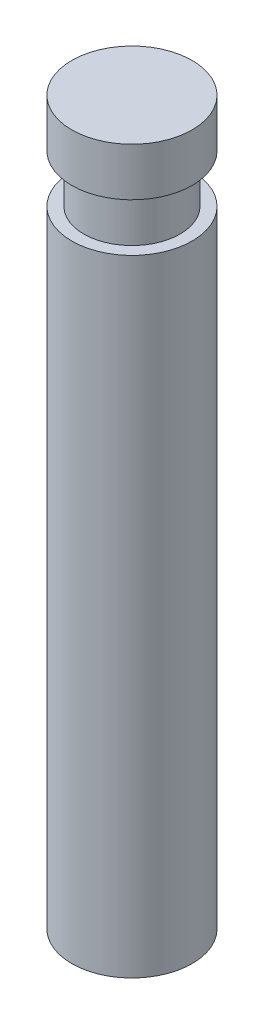
ISO-10303-21;
HEADER;
FILE_DESCRIPTION(('STEP AP214'),'2;1');
FILE_NAME('part.step','',(''),(''),'','','');
FILE_SCHEMA(('AUTOMOTIVE_DESIGN { 1 0 10303 214 1 1 1 1 }'));
ENDSEC;
DATA;
#1=APPLICATION_CONTEXT('core data for automotive mechanical design processes');
#2=APPLICATION_PROTOCOL_DEFINITION('international standard','automotive_design',2000,#1);
#3=PRODUCT_CONTEXT('',#1,'mechanical');
#4=PRODUCT('Part','Part','',(#3));
#5=PRODUCT_RELATED_PRODUCT_CATEGORY('part','',(#4));
#6=PRODUCT_DEFINITION_FORMATION('','',#4);
#7=PRODUCT_DEFINITION_CONTEXT('part definition',#1,'design');
#8=PRODUCT_DEFINITION('design','',#6,#7);
#9=PRODUCT_DEFINITION_SHAPE('','',#8);
#10=(LENGTH_UNIT() NAMED_UNIT(*) SI_UNIT(.MILLI.,.METRE.));
#11=(NAMED_UNIT(*) PLANE_ANGLE_UNIT() SI_UNIT($,.RADIAN.));
#12=(NAMED_UNIT(*) SI_UNIT($,.STERADIAN.) SOLID_ANGLE_UNIT());
#13=UNCERTAINTY_MEASURE_WITH_UNIT(LENGTH_MEASURE(1.E-05),#10,'distance_accuracy_value','');
#14=(GEOMETRIC_REPRESENTATION_CONTEXT(3) GLOBAL_UNCERTAINTY_ASSIGNED_CONTEXT((#13)) GLOBAL_UNIT_ASSIGNED_CONTEXT((#10,
#11,#12)) REPRESENTATION_CONTEXT('',''));
#15=CARTESIAN_POINT('',(0.,0.,0.));
#16=DIRECTION('',(0.,0.,1.));
#17=DIRECTION('',(1.,0.,0.));
#18=AXIS2_PLACEMENT_3D('',#15,#16,#17);
#19=CARTESIAN_POINT('',(0.,26.,0.));
#20=DIRECTION('',(0.,-1.,0.));
#21=DIRECTION('',(0.,0.,-1.));
#22=AXIS2_PLACEMENT_3D('',#19,#20,#21);
#23=CYLINDRICAL_SURFACE('',#22,2.5);
#24=CARTESIAN_POINT('',(0.,26.,0.));
#25=DIRECTION('',(0.,1.,0.));
#26=DIRECTION('',(0.,0.,1.));
#27=AXIS2_PLACEMENT_3D('',#24,#25,#26);
#28=CIRCLE('',#27,2.5);
#29=CARTESIAN_POINT('',(0.,26.,2.5));
#30=VERTEX_POINT('',#29);
#31=EDGE_CURVE('E38',#30,#30,#28,.T.);
#32=ORIENTED_EDGE('',*,*,#31,.F.);
#33=EDGE_LOOP('',(#32));
#34=FACE_BOUND('',#33,.T.);
#35=CARTESIAN_POINT('',(0.,0.,0.));
#36=DIRECTION('',(0.,1.,0.));
#37=DIRECTION('',(0.,0.,1.));
#38=AXIS2_PLACEMENT_3D('',#35,#36,#37);
#39=CIRCLE('',#38,2.5);
#40=CARTESIAN_POINT('',(0.,0.,2.5));
#41=VERTEX_POINT('',#40);
#42=EDGE_CURVE('E34',#41,#41,#39,.T.);
#43=ORIENTED_EDGE('',*,*,#42,.T.);
#44=EDGE_LOOP('',(#43));
#45=FACE_BOUND('',#44,.T.);
#46=ADVANCED_FACE('F31',(#34,#45),#23,.T.);
#47=CARTESIAN_POINT('',(0.,26.,0.));
#48=DIRECTION('',(0.,1.,0.));
#49=DIRECTION('',(0.,0.,1.));
#50=AXIS2_PLACEMENT_3D('',#47,#48,#49);
#51=PLANE('',#50);
#52=CARTESIAN_POINT('',(0.,26.,0.));
#53=DIRECTION('',(0.,1.,0.));
#54=DIRECTION('',(0.,0.,1.));
#55=AXIS2_PLACEMENT_3D('',#52,#53,#54);
#56=CIRCLE('',#55,2.);
#57=CARTESIAN_POINT('',(0.,26.,2.));
#58=VERTEX_POINT('',#57);
#59=EDGE_CURVE('E10',#58,#58,#56,.T.);
#60=ORIENTED_EDGE('',*,*,#59,.F.);
#61=EDGE_LOOP('',(#60));
#62=FACE_BOUND('',#61,.T.);
#63=ORIENTED_EDGE('',*,*,#31,.T.);
#64=EDGE_LOOP('',(#63));
#65=FACE_BOUND('',#64,.T.);
#66=ADVANCED_FACE('F78',(#62,#65),#51,.T.);
#67=CARTESIAN_POINT('',(0.,0.,0.));
#68=DIRECTION('',(0.,1.,0.));
#69=DIRECTION('',(0.,0.,1.));
#70=AXIS2_PLACEMENT_3D('',#67,#68,#69);
#71=PLANE('',#70);
#72=CARTESIAN_POINT('',(0.,0.,0.));
#73=DIRECTION('',(0.,1.,0.));
#74=DIRECTION('',(0.,0.,1.));
#75=AXIS2_PLACEMENT_3D('',#72,#73,#74);
#76=CIRCLE('',#75,1.);
#77=CARTESIAN_POINT('',(0.,0.,1.));
#78=VERTEX_POINT('',#77);
#79=EDGE_CURVE('E50',#78,#78,#76,.T.);
#80=ORIENTED_EDGE('',*,*,#79,.T.);
#81=EDGE_LOOP('',(#80));
#82=FACE_BOUND('',#81,.T.);
#83=ORIENTED_EDGE('',*,*,#42,.F.);
#84=EDGE_LOOP('',(#83));
#85=FACE_BOUND('',#84,.T.);
#86=ADVANCED_FACE('F83',(#82,#85),#71,.F.);
#87=CARTESIAN_POINT('',(0.,10.,0.));
#88=DIRECTION('',(0.,-1.,0.));
#89=DIRECTION('',(0.,0.,-1.));
#90=AXIS2_PLACEMENT_3D('',#87,#88,#89);
#91=CYLINDRICAL_SURFACE('',#90,1.);
#92=CARTESIAN_POINT('',(0.,10.,0.));
#93=DIRECTION('',(0.,1.,0.));
#94=DIRECTION('',(0.,0.,1.));
#95=AXIS2_PLACEMENT_3D('',#92,#93,#94);
#96=CIRCLE('',#95,1.);
#97=CARTESIAN_POINT('',(0.,10.,1.));
#98=VERTEX_POINT('',#97);
#99=EDGE_CURVE('E47',#98,#98,#96,.T.);
#100=ORIENTED_EDGE('',*,*,#99,.T.);
#101=EDGE_LOOP('',(#100));
#102=FACE_BOUND('',#101,.T.);
#103=ORIENTED_EDGE('',*,*,#79,.F.);
#104=EDGE_LOOP('',(#103));
#105=FACE_BOUND('',#104,.T.);
#106=ADVANCED_FACE('F92',(#102,#105),#91,.F.);
#107=CARTESIAN_POINT('',(0.,10.,0.));
#108=DIRECTION('',(0.,1.,0.));
#109=DIRECTION('',(0.,0.,1.));
#110=AXIS2_PLACEMENT_3D('',#107,#108,#109);
#111=PLANE('',#110);
#112=ORIENTED_EDGE('',*,*,#99,.F.);
#113=EDGE_LOOP('',(#112));
#114=FACE_BOUND('',#113,.T.);
#115=ADVANCED_FACE('F96',(#114),#111,.F.);
#116=CARTESIAN_POINT('',(0.,28.,0.));
#117=DIRECTION('',(0.,-1.,0.));
#118=DIRECTION('',(0.,0.,-1.));
#119=AXIS2_PLACEMENT_3D('',#116,#117,#118);
#120=CYLINDRICAL_SURFACE('',#119,2.);
#121=CARTESIAN_POINT('',(0.,28.,0.));
#122=DIRECTION('',(0.,1.,0.));
#123=DIRECTION('',(0.,0.,1.));
#124=AXIS2_PLACEMENT_3D('',#121,#122,#123);
#125=CIRCLE('',#124,2.);
#126=CARTESIAN_POINT('',(0.,28.,2.));
#127=VERTEX_POINT('',#126);
#128=EDGE_CURVE('E45',#127,#127,#125,.T.);
#129=ORIENTED_EDGE('',*,*,#128,.F.);
#130=EDGE_LOOP('',(#129));
#131=FACE_BOUND('',#130,.T.);
#132=ORIENTED_EDGE('',*,*,#59,.T.);
#133=EDGE_LOOP('',(#132));
#134=FACE_BOUND('',#133,.T.);
#135=ADVANCED_FACE('F102',(#131,#134),#120,.T.);
#136=CARTESIAN_POINT('',(0.,30.,0.));
#137=DIRECTION('',(0.,-1.,0.));
#138=DIRECTION('',(0.,0.,-1.));
#139=AXIS2_PLACEMENT_3D('',#136,#137,#138);
#140=CYLINDRICAL_SURFACE('',#139,2.5);
#141=CARTESIAN_POINT('',(0.,30.,0.));
#142=DIRECTION('',(0.,1.,0.));
#143=DIRECTION('',(0.,0.,1.));
#144=AXIS2_PLACEMENT_3D('',#141,#142,#143);
#145=CIRCLE('',#144,2.5);
#146=CARTESIAN_POINT('',(0.,30.,2.5));
#147=VERTEX_POINT('',#146);
#148=EDGE_CURVE('E55',#147,#147,#145,.T.);
#149=ORIENTED_EDGE('',*,*,#148,.F.);
#150=EDGE_LOOP('',(#149));
#151=FACE_BOUND('',#150,.T.);
#152=CARTESIAN_POINT('',(0.,28.,0.));
#153=DIRECTION('',(0.,1.,0.));
#154=DIRECTION('',(0.,0.,1.));
#155=AXIS2_PLACEMENT_3D('',#152,#153,#154);
#156=CIRCLE('',#155,2.5);
#157=CARTESIAN_POINT('',(0.,28.,2.5));
#158=VERTEX_POINT('',#157);
#159=EDGE_CURVE('E59',#158,#158,#156,.T.);
#160=ORIENTED_EDGE('',*,*,#159,.T.);
#161=EDGE_LOOP('',(#160));
#162=FACE_BOUND('',#161,.T.);
#163=ADVANCED_FACE('F66',(#151,#162),#140,.T.);
#164=CARTESIAN_POINT('',(0.,30.,0.));
#165=DIRECTION('',(0.,1.,0.));
#166=DIRECTION('',(0.,0.,1.));
#167=AXIS2_PLACEMENT_3D('',#164,#165,#166);
#168=PLANE('',#167);
#169=ORIENTED_EDGE('',*,*,#148,.T.);
#170=EDGE_LOOP('',(#169));
#171=FACE_BOUND('',#170,.T.);
#172=ADVANCED_FACE('F70',(#171),#168,.T.);
#173=CARTESIAN_POINT('',(0.,28.,0.));
#174=DIRECTION('',(0.,1.,0.));
#175=DIRECTION('',(0.,0.,1.));
#176=AXIS2_PLACEMENT_3D('',#173,#174,#175);
#177=PLANE('',#176);
#178=ORIENTED_EDGE('',*,*,#128,.T.);
#179=EDGE_LOOP('',(#178));
#180=FACE_BOUND('',#179,.T.);
#181=ORIENTED_EDGE('',*,*,#159,.F.);
#182=EDGE_LOOP('',(#181));
#183=FACE_BOUND('',#182,.T.);
#184=ADVANCED_FACE('F68',(#180,#183),#177,.F.);
#185=CLOSED_SHELL('',(#46,#66,#86,#106,#115,#135,#163,#172,#184));
#186=MANIFOLD_SOLID_BREP('B2',#185);
#187=ADVANCED_BREP_SHAPE_REPRESENTATION('',(#18,#186),#14);
#188=SHAPE_DEFINITION_REPRESENTATION(#9,#187);
ENDSEC;
END-ISO-10303-21;
